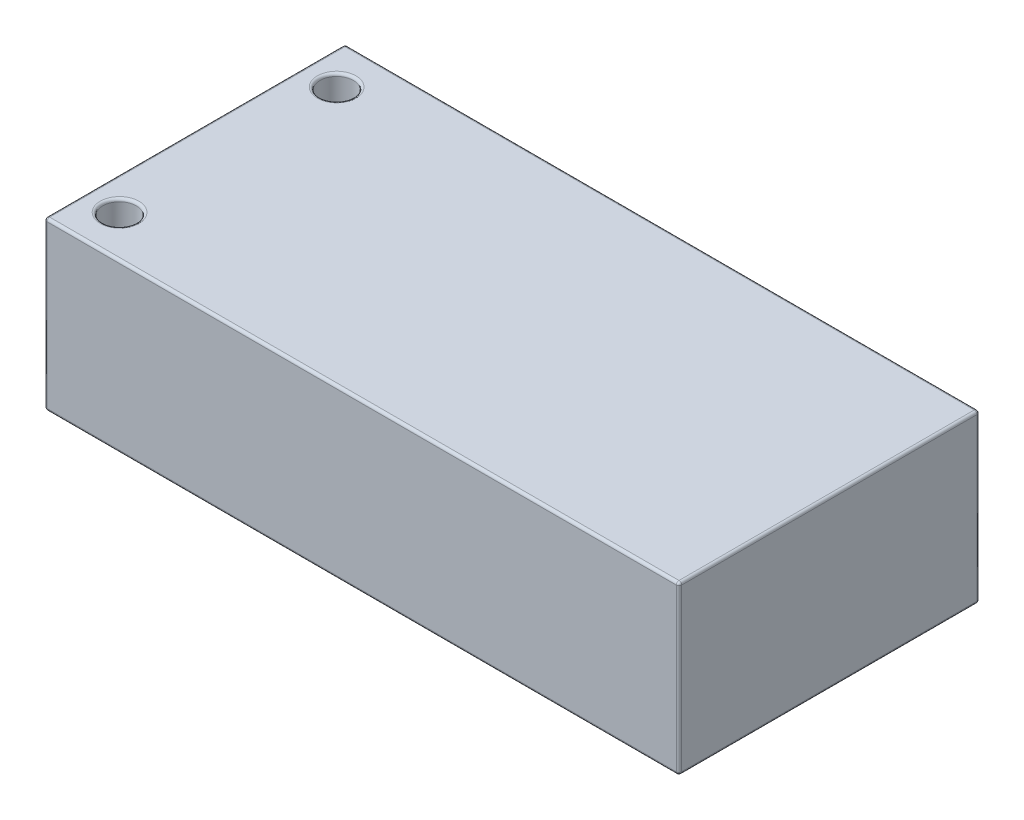
ISO-10303-21;
HEADER;
FILE_DESCRIPTION(('STEP AP214'),'2;1');
FILE_NAME('part.step','',(''),(''),'','','');
FILE_SCHEMA(('AUTOMOTIVE_DESIGN { 1 0 10303 214 1 1 1 1 }'));
ENDSEC;
DATA;
#1=APPLICATION_CONTEXT('core data for automotive mechanical design processes');
#2=APPLICATION_PROTOCOL_DEFINITION('international standard','automotive_design',2000,#1);
#3=PRODUCT_CONTEXT('',#1,'mechanical');
#4=PRODUCT('Part','Part','',(#3));
#5=PRODUCT_RELATED_PRODUCT_CATEGORY('part','',(#4));
#6=PRODUCT_DEFINITION_FORMATION('','',#4);
#7=PRODUCT_DEFINITION_CONTEXT('part definition',#1,'design');
#8=PRODUCT_DEFINITION('design','',#6,#7);
#9=PRODUCT_DEFINITION_SHAPE('','',#8);
#10=(LENGTH_UNIT() NAMED_UNIT(*) SI_UNIT(.MILLI.,.METRE.));
#11=(NAMED_UNIT(*) PLANE_ANGLE_UNIT() SI_UNIT($,.RADIAN.));
#12=(NAMED_UNIT(*) SI_UNIT($,.STERADIAN.) SOLID_ANGLE_UNIT());
#13=UNCERTAINTY_MEASURE_WITH_UNIT(LENGTH_MEASURE(1.E-05),#10,'distance_accuracy_value','');
#14=(GEOMETRIC_REPRESENTATION_CONTEXT(3) GLOBAL_UNCERTAINTY_ASSIGNED_CONTEXT((#13)) GLOBAL_UNIT_ASSIGNED_CONTEXT((#10,
#11,#12)) REPRESENTATION_CONTEXT('',''));
#15=CARTESIAN_POINT('',(0.,0.,0.));
#16=DIRECTION('',(0.,0.,1.));
#17=DIRECTION('',(1.,0.,0.));
#18=AXIS2_PLACEMENT_3D('',#15,#16,#17);
#19=CARTESIAN_POINT('',(0.,25.,0.));
#20=DIRECTION('',(1.,0.,0.));
#21=DIRECTION('',(0.,0.,-1.));
#22=AXIS2_PLACEMENT_3D('',#19,#20,#21);
#23=PLANE('',#22);
#24=DIRECTION('',(0.,0.,1.));
#25=VECTOR('',#24,1.);
#26=CARTESIAN_POINT('',(0.,24.6,0.));
#27=LINE('',#26,#25);
#28=CARTESIAN_POINT('',(0.,24.6,-0.4));
#29=VERTEX_POINT('',#28);
#30=CARTESIAN_POINT('',(0.,24.6,-44.6));
#31=VERTEX_POINT('',#30);
#32=EDGE_CURVE('E188',#29,#31,#27,.F.);
#33=ORIENTED_EDGE('',*,*,#32,.T.);
#34=DIRECTION('',(0.,-1.,0.));
#35=VECTOR('',#34,1.);
#36=CARTESIAN_POINT('',(0.,25.,-44.6));
#37=LINE('',#36,#35);
#38=CARTESIAN_POINT('',(0.,0.400000000000001,-44.6));
#39=VERTEX_POINT('',#38);
#40=EDGE_CURVE('E142',#31,#39,#37,.T.);
#41=ORIENTED_EDGE('',*,*,#40,.T.);
#42=DIRECTION('',(0.,0.,1.));
#43=VECTOR('',#42,1.);
#44=CARTESIAN_POINT('',(0.,0.400000000000001,0.));
#45=LINE('',#44,#43);
#46=CARTESIAN_POINT('',(0.,0.400000000000001,-0.4));
#47=VERTEX_POINT('',#46);
#48=EDGE_CURVE('E192',#39,#47,#45,.T.);
#49=ORIENTED_EDGE('',*,*,#48,.T.);
#50=DIRECTION('',(0.,-1.,0.));
#51=VECTOR('',#50,1.);
#52=CARTESIAN_POINT('',(0.,25.,-0.4));
#53=LINE('',#52,#51);
#54=EDGE_CURVE('E190',#47,#29,#53,.F.);
#55=ORIENTED_EDGE('',*,*,#54,.T.);
#56=EDGE_LOOP('',(#33,#41,#49,#55));
#57=FACE_BOUND('',#56,.T.);
#58=ADVANCED_FACE('F33',(#57),#23,.F.);
#59=CARTESIAN_POINT('',(0.,25.,0.));
#60=DIRECTION('',(0.,0.,-1.));
#61=DIRECTION('',(-1.,0.,0.));
#62=AXIS2_PLACEMENT_3D('',#59,#60,#61);
#63=PLANE('',#62);
#64=DIRECTION('',(0.,-1.,0.));
#65=VECTOR('',#64,1.);
#66=CARTESIAN_POINT('',(0.4,25.,0.));
#67=LINE('',#66,#65);
#68=CARTESIAN_POINT('',(0.4,24.6,0.));
#69=VERTEX_POINT('',#68);
#70=CARTESIAN_POINT('',(0.4,0.400000000000001,0.));
#71=VERTEX_POINT('',#70);
#72=EDGE_CURVE('E199',#69,#71,#67,.T.);
#73=ORIENTED_EDGE('',*,*,#72,.T.);
#74=DIRECTION('',(1.,0.,0.));
#75=VECTOR('',#74,1.);
#76=CARTESIAN_POINT('',(95.,0.400000000000001,0.));
#77=LINE('',#76,#75);
#78=CARTESIAN_POINT('',(94.6,0.400000000000001,0.));
#79=VERTEX_POINT('',#78);
#80=EDGE_CURVE('E202',#71,#79,#77,.T.);
#81=ORIENTED_EDGE('',*,*,#80,.T.);
#82=DIRECTION('',(0.,-1.,0.));
#83=VECTOR('',#82,1.);
#84=CARTESIAN_POINT('',(94.6,25.,0.));
#85=LINE('',#84,#83);
#86=CARTESIAN_POINT('',(94.6,24.6,0.));
#87=VERTEX_POINT('',#86);
#88=EDGE_CURVE('E197',#79,#87,#85,.F.);
#89=ORIENTED_EDGE('',*,*,#88,.T.);
#90=DIRECTION('',(1.,0.,0.));
#91=VECTOR('',#90,1.);
#92=CARTESIAN_POINT('',(0.,24.6,0.));
#93=LINE('',#92,#91);
#94=EDGE_CURVE('E195',#87,#69,#93,.F.);
#95=ORIENTED_EDGE('',*,*,#94,.T.);
#96=EDGE_LOOP('',(#73,#81,#89,#95));
#97=FACE_BOUND('',#96,.T.);
#98=ADVANCED_FACE('F297',(#97),#63,.F.);
#99=CARTESIAN_POINT('',(95.,25.,0.));
#100=DIRECTION('',(-1.,0.,0.));
#101=DIRECTION('',(0.,0.,1.));
#102=AXIS2_PLACEMENT_3D('',#99,#100,#101);
#103=PLANE('',#102);
#104=DIRECTION('',(0.,0.,-1.));
#105=VECTOR('',#104,1.);
#106=CARTESIAN_POINT('',(95.,0.400000000000001,-45.));
#107=LINE('',#106,#105);
#108=CARTESIAN_POINT('',(95.,0.400000000000001,-0.4));
#109=VERTEX_POINT('',#108);
#110=CARTESIAN_POINT('',(95.,0.400000000000001,-44.6));
#111=VERTEX_POINT('',#110);
#112=EDGE_CURVE('E174',#109,#111,#107,.T.);
#113=ORIENTED_EDGE('',*,*,#112,.T.);
#114=DIRECTION('',(0.,-1.,0.));
#115=VECTOR('',#114,1.);
#116=CARTESIAN_POINT('',(95.,25.,-44.6));
#117=LINE('',#116,#115);
#118=CARTESIAN_POINT('',(95.,24.6,-44.6));
#119=VERTEX_POINT('',#118);
#120=EDGE_CURVE('E176',#111,#119,#117,.F.);
#121=ORIENTED_EDGE('',*,*,#120,.T.);
#122=DIRECTION('',(0.,0.,-1.));
#123=VECTOR('',#122,1.);
#124=CARTESIAN_POINT('',(95.,24.6,0.));
#125=LINE('',#124,#123);
#126=CARTESIAN_POINT('',(95.,24.6,-0.4));
#127=VERTEX_POINT('',#126);
#128=EDGE_CURVE('E170',#119,#127,#125,.F.);
#129=ORIENTED_EDGE('',*,*,#128,.T.);
#130=DIRECTION('',(0.,-1.,0.));
#131=VECTOR('',#130,1.);
#132=CARTESIAN_POINT('',(95.,25.,-0.4));
#133=LINE('',#132,#131);
#134=EDGE_CURVE('E172',#127,#109,#133,.T.);
#135=ORIENTED_EDGE('',*,*,#134,.T.);
#136=EDGE_LOOP('',(#113,#121,#129,#135));
#137=FACE_BOUND('',#136,.T.);
#138=ADVANCED_FACE('F303',(#137),#103,.F.);
#139=CARTESIAN_POINT('',(0.,25.,-45.));
#140=DIRECTION('',(0.,0.,1.));
#141=DIRECTION('',(1.,0.,0.));
#142=AXIS2_PLACEMENT_3D('',#139,#140,#141);
#143=PLANE('',#142);
#144=DIRECTION('',(-1.,0.,0.));
#145=VECTOR('',#144,1.);
#146=CARTESIAN_POINT('',(0.,24.6,-45.));
#147=LINE('',#146,#145);
#148=CARTESIAN_POINT('',(0.4,24.6,-45.));
#149=VERTEX_POINT('',#148);
#150=CARTESIAN_POINT('',(94.6,24.6,-45.));
#151=VERTEX_POINT('',#150);
#152=EDGE_CURVE('E128',#149,#151,#147,.F.);
#153=ORIENTED_EDGE('',*,*,#152,.T.);
#154=DIRECTION('',(0.,-1.,0.));
#155=VECTOR('',#154,1.);
#156=CARTESIAN_POINT('',(94.6,25.,-45.));
#157=LINE('',#156,#155);
#158=CARTESIAN_POINT('',(94.6,0.400000000000001,-45.));
#159=VERTEX_POINT('',#158);
#160=EDGE_CURVE('E168',#151,#159,#157,.T.);
#161=ORIENTED_EDGE('',*,*,#160,.T.);
#162=DIRECTION('',(-1.,0.,0.));
#163=VECTOR('',#162,1.);
#164=CARTESIAN_POINT('',(0.,0.400000000000001,-45.));
#165=LINE('',#164,#163);
#166=CARTESIAN_POINT('',(0.4,0.400000000000001,-45.));
#167=VERTEX_POINT('',#166);
#168=EDGE_CURVE('E131',#159,#167,#165,.T.);
#169=ORIENTED_EDGE('',*,*,#168,.T.);
#170=DIRECTION('',(0.,-1.,0.));
#171=VECTOR('',#170,1.);
#172=CARTESIAN_POINT('',(0.4,25.,-45.));
#173=LINE('',#172,#171);
#174=EDGE_CURVE('E123',#167,#149,#173,.F.);
#175=ORIENTED_EDGE('',*,*,#174,.T.);
#176=EDGE_LOOP('',(#153,#161,#169,#175));
#177=FACE_BOUND('',#176,.T.);
#178=ADVANCED_FACE('F125',(#177),#143,.F.);
#179=CARTESIAN_POINT('',(0.,25.,0.));
#180=DIRECTION('',(0.,-1.,0.));
#181=DIRECTION('',(0.,0.,-1.));
#182=AXIS2_PLACEMENT_3D('',#179,#180,#181);
#183=PLANE('',#182);
#184=DIRECTION('',(0.,0.,-1.));
#185=VECTOR('',#184,1.);
#186=CARTESIAN_POINT('',(94.6,25.,0.));
#187=LINE('',#186,#185);
#188=CARTESIAN_POINT('',(94.6,25.,-0.4));
#189=VERTEX_POINT('',#188);
#190=CARTESIAN_POINT('',(94.6,25.,-44.6));
#191=VERTEX_POINT('',#190);
#192=EDGE_CURVE('E50',#189,#191,#187,.T.);
#193=ORIENTED_EDGE('',*,*,#192,.T.);
#194=DIRECTION('',(-1.,0.,0.));
#195=VECTOR('',#194,1.);
#196=CARTESIAN_POINT('',(0.,25.,-44.6));
#197=LINE('',#196,#195);
#198=CARTESIAN_POINT('',(0.4,25.,-44.6));
#199=VERTEX_POINT('',#198);
#200=EDGE_CURVE('E214',#191,#199,#197,.T.);
#201=ORIENTED_EDGE('',*,*,#200,.T.);
#202=DIRECTION('',(0.,0.,1.));
#203=VECTOR('',#202,1.);
#204=CARTESIAN_POINT('',(0.4,25.,0.));
#205=LINE('',#204,#203);
#206=CARTESIAN_POINT('',(0.4,25.,-0.4));
#207=VERTEX_POINT('',#206);
#208=EDGE_CURVE('E210',#199,#207,#205,.T.);
#209=ORIENTED_EDGE('',*,*,#208,.T.);
#210=DIRECTION('',(1.,0.,0.));
#211=VECTOR('',#210,1.);
#212=CARTESIAN_POINT('',(0.,25.,-0.4));
#213=LINE('',#212,#211);
#214=EDGE_CURVE('E55',#207,#189,#213,.T.);
#215=ORIENTED_EDGE('',*,*,#214,.T.);
#216=EDGE_LOOP('',(#193,#201,#209,#215));
#217=FACE_BOUND('',#216,.T.);
#218=CARTESIAN_POINT('',(5.,25.,-6.25));
#219=DIRECTION('',(0.,-1.,0.));
#220=DIRECTION('',(0.,0.,-1.));
#221=AXIS2_PLACEMENT_3D('',#218,#219,#220);
#222=CIRCLE('',#221,2.9);
#223=CARTESIAN_POINT('',(5.,25.,-9.15));
#224=VERTEX_POINT('',#223);
#225=EDGE_CURVE('E207',#224,#224,#222,.T.);
#226=ORIENTED_EDGE('',*,*,#225,.T.);
#227=EDGE_LOOP('',(#226));
#228=FACE_BOUND('',#227,.T.);
#229=CARTESIAN_POINT('',(5.,25.,-38.75));
#230=DIRECTION('',(0.,-1.,0.));
#231=DIRECTION('',(0.,0.,-1.));
#232=AXIS2_PLACEMENT_3D('',#229,#230,#231);
#233=CIRCLE('',#232,2.9);
#234=CARTESIAN_POINT('',(5.,25.,-41.65));
#235=VERTEX_POINT('',#234);
#236=EDGE_CURVE('E204',#235,#235,#233,.T.);
#237=ORIENTED_EDGE('',*,*,#236,.T.);
#238=EDGE_LOOP('',(#237));
#239=FACE_BOUND('',#238,.T.);
#240=ADVANCED_FACE('F292',(#217,#228,#239),#183,.F.);
#241=CARTESIAN_POINT('',(0.,0.,0.));
#242=DIRECTION('',(0.,-1.,0.));
#243=DIRECTION('',(0.,0.,-1.));
#244=AXIS2_PLACEMENT_3D('',#241,#242,#243);
#245=PLANE('',#244);
#246=DIRECTION('',(-1.,0.,0.));
#247=VECTOR('',#246,1.);
#248=CARTESIAN_POINT('',(95.,0.,-44.6));
#249=LINE('',#248,#247);
#250=CARTESIAN_POINT('',(0.4,0.,-44.6));
#251=VERTEX_POINT('',#250);
#252=CARTESIAN_POINT('',(94.6,0.,-44.6));
#253=VERTEX_POINT('',#252);
#254=EDGE_CURVE('E183',#251,#253,#249,.F.);
#255=ORIENTED_EDGE('',*,*,#254,.T.);
#256=DIRECTION('',(0.,0.,-1.));
#257=VECTOR('',#256,1.);
#258=CARTESIAN_POINT('',(94.6,0.,0.));
#259=LINE('',#258,#257);
#260=CARTESIAN_POINT('',(94.6,0.,-0.4));
#261=VERTEX_POINT('',#260);
#262=EDGE_CURVE('E185',#253,#261,#259,.F.);
#263=ORIENTED_EDGE('',*,*,#262,.T.);
#264=DIRECTION('',(1.,0.,0.));
#265=VECTOR('',#264,1.);
#266=CARTESIAN_POINT('',(0.,0.,-0.4));
#267=LINE('',#266,#265);
#268=CARTESIAN_POINT('',(0.4,0.,-0.4));
#269=VERTEX_POINT('',#268);
#270=EDGE_CURVE('E179',#261,#269,#267,.F.);
#271=ORIENTED_EDGE('',*,*,#270,.T.);
#272=DIRECTION('',(0.,0.,1.));
#273=VECTOR('',#272,1.);
#274=CARTESIAN_POINT('',(0.4,0.,-45.));
#275=LINE('',#274,#273);
#276=EDGE_CURVE('E181',#269,#251,#275,.F.);
#277=ORIENTED_EDGE('',*,*,#276,.T.);
#278=EDGE_LOOP('',(#255,#263,#271,#277));
#279=FACE_BOUND('',#278,.T.);
#280=ADVANCED_FACE('F283',(#279),#245,.T.);
#281=CARTESIAN_POINT('',(5.,15.,-6.25));
#282=DIRECTION('',(0.,1.,0.));
#283=DIRECTION('',(0.,0.,1.));
#284=AXIS2_PLACEMENT_3D('',#281,#282,#283);
#285=CYLINDRICAL_SURFACE('',#284,2.5);
#286=CARTESIAN_POINT('',(5.,24.6,-6.25));
#287=DIRECTION('',(0.,-1.,0.));
#288=DIRECTION('',(0.,0.,-1.));
#289=AXIS2_PLACEMENT_3D('',#286,#287,#288);
#290=CIRCLE('',#289,2.5);
#291=CARTESIAN_POINT('',(5.,24.6,-8.75));
#292=VERTEX_POINT('',#291);
#293=EDGE_CURVE('E42',#292,#292,#290,.F.);
#294=ORIENTED_EDGE('',*,*,#293,.T.);
#295=EDGE_LOOP('',(#294));
#296=FACE_BOUND('',#295,.T.);
#297=CARTESIAN_POINT('',(5.,15.,-6.25));
#298=DIRECTION('',(0.,1.,0.));
#299=DIRECTION('',(0.,0.,1.));
#300=AXIS2_PLACEMENT_3D('',#297,#298,#299);
#301=CIRCLE('',#300,2.5);
#302=CARTESIAN_POINT('',(5.,15.,-3.75));
#303=VERTEX_POINT('',#302);
#304=EDGE_CURVE('E163',#303,#303,#301,.T.);
#305=ORIENTED_EDGE('',*,*,#304,.F.);
#306=EDGE_LOOP('',(#305));
#307=FACE_BOUND('',#306,.T.);
#308=ADVANCED_FACE('F281',(#296,#307),#285,.F.);
#309=CARTESIAN_POINT('',(5.,15.,-6.25));
#310=DIRECTION('',(0.,1.,0.));
#311=DIRECTION('',(0.,0.,1.));
#312=AXIS2_PLACEMENT_3D('',#309,#310,#311);
#313=PLANE('',#312);
#314=ORIENTED_EDGE('',*,*,#304,.T.);
#315=EDGE_LOOP('',(#314));
#316=FACE_BOUND('',#315,.T.);
#317=ADVANCED_FACE('F279',(#316),#313,.T.);
#318=CARTESIAN_POINT('',(5.,15.,-38.75));
#319=DIRECTION('',(0.,1.,0.));
#320=DIRECTION('',(0.,0.,1.));
#321=AXIS2_PLACEMENT_3D('',#318,#319,#320);
#322=CYLINDRICAL_SURFACE('',#321,2.5);
#323=CARTESIAN_POINT('',(5.,24.6,-38.75));
#324=DIRECTION('',(0.,-1.,0.));
#325=DIRECTION('',(0.,0.,-1.));
#326=AXIS2_PLACEMENT_3D('',#323,#324,#325);
#327=CIRCLE('',#326,2.5);
#328=CARTESIAN_POINT('',(5.,24.6,-41.25));
#329=VERTEX_POINT('',#328);
#330=EDGE_CURVE('E11',#329,#329,#327,.F.);
#331=ORIENTED_EDGE('',*,*,#330,.T.);
#332=EDGE_LOOP('',(#331));
#333=FACE_BOUND('',#332,.T.);
#334=CARTESIAN_POINT('',(5.,15.,-38.75));
#335=DIRECTION('',(0.,1.,0.));
#336=DIRECTION('',(0.,0.,1.));
#337=AXIS2_PLACEMENT_3D('',#334,#335,#336);
#338=CIRCLE('',#337,2.5);
#339=CARTESIAN_POINT('',(5.,15.,-36.25));
#340=VERTEX_POINT('',#339);
#341=EDGE_CURVE('E160',#340,#340,#338,.T.);
#342=ORIENTED_EDGE('',*,*,#341,.F.);
#343=EDGE_LOOP('',(#342));
#344=FACE_BOUND('',#343,.T.);
#345=ADVANCED_FACE('F290',(#333,#344),#322,.F.);
#346=CARTESIAN_POINT('',(5.,15.,-38.75));
#347=DIRECTION('',(0.,1.,0.));
#348=DIRECTION('',(0.,0.,1.));
#349=AXIS2_PLACEMENT_3D('',#346,#347,#348);
#350=PLANE('',#349);
#351=ORIENTED_EDGE('',*,*,#341,.T.);
#352=EDGE_LOOP('',(#351));
#353=FACE_BOUND('',#352,.T.);
#354=ADVANCED_FACE('F379',(#353),#350,.T.);
#355=CARTESIAN_POINT('',(0.4,25.,-0.4));
#356=DIRECTION('',(0.,-1.,0.));
#357=DIRECTION('',(0.,0.,-1.));
#358=AXIS2_PLACEMENT_3D('',#355,#356,#357);
#359=CYLINDRICAL_SURFACE('',#358,0.4);
#360=CARTESIAN_POINT('',(0.4,24.6,-0.4));
#361=DIRECTION('',(0.,1.,0.));
#362=DIRECTION('',(0.,0.,1.));
#363=AXIS2_PLACEMENT_3D('',#360,#361,#362);
#364=CIRCLE('',#363,0.4);
#365=EDGE_CURVE('E37',#29,#69,#364,.T.);
#366=ORIENTED_EDGE('',*,*,#365,.F.);
#367=ORIENTED_EDGE('',*,*,#54,.F.);
#368=CARTESIAN_POINT('',(0.4,0.400000000000001,-0.4));
#369=DIRECTION('',(0.,-1.,0.));
#370=DIRECTION('',(0.,0.,-1.));
#371=AXIS2_PLACEMENT_3D('',#368,#369,#370);
#372=CIRCLE('',#371,0.4);
#373=EDGE_CURVE('E265',#71,#47,#372,.T.);
#374=ORIENTED_EDGE('',*,*,#373,.F.);
#375=ORIENTED_EDGE('',*,*,#72,.F.);
#376=EDGE_LOOP('',(#366,#367,#374,#375));
#377=FACE_BOUND('',#376,.T.);
#378=ADVANCED_FACE('F377',(#377),#359,.T.);
#379=CARTESIAN_POINT('',(0.4,24.6,-0.4));
#380=DIRECTION('',(0.,0.,1.));
#381=DIRECTION('',(1.,0.,0.));
#382=AXIS2_PLACEMENT_3D('',#379,#380,#381);
#383=SPHERICAL_SURFACE('',#382,0.4);
#384=CARTESIAN_POINT('',(0.4,24.6,-0.4));
#385=DIRECTION('',(0.,0.,1.));
#386=DIRECTION('',(1.,0.,0.));
#387=AXIS2_PLACEMENT_3D('',#384,#385,#386);
#388=CIRCLE('',#387,0.4);
#389=EDGE_CURVE('E260',#29,#207,#388,.F.);
#390=ORIENTED_EDGE('',*,*,#389,.F.);
#391=ORIENTED_EDGE('',*,*,#365,.T.);
#392=CARTESIAN_POINT('',(0.4,24.6,-0.4));
#393=DIRECTION('',(-1.,0.,0.));
#394=DIRECTION('',(0.,0.,1.));
#395=AXIS2_PLACEMENT_3D('',#392,#393,#394);
#396=CIRCLE('',#395,0.4);
#397=EDGE_CURVE('E263',#207,#69,#396,.F.);
#398=ORIENTED_EDGE('',*,*,#397,.F.);
#399=EDGE_LOOP('',(#390,#391,#398));
#400=FACE_BOUND('',#399,.T.);
#401=ADVANCED_FACE('F374',(#400),#383,.T.);
#402=CARTESIAN_POINT('',(0.4,0.4,-0.4));
#403=DIRECTION('',(0.,0.,1.));
#404=DIRECTION('',(1.,0.,0.));
#405=AXIS2_PLACEMENT_3D('',#402,#403,#404);
#406=SPHERICAL_SURFACE('',#405,0.4);
#407=CARTESIAN_POINT('',(0.4,0.4,-0.4));
#408=DIRECTION('',(-1.,0.,0.));
#409=DIRECTION('',(0.,0.,1.));
#410=AXIS2_PLACEMENT_3D('',#407,#408,#409);
#411=CIRCLE('',#410,0.4);
#412=EDGE_CURVE('E254',#71,#269,#411,.F.);
#413=ORIENTED_EDGE('',*,*,#412,.F.);
#414=ORIENTED_EDGE('',*,*,#373,.T.);
#415=CARTESIAN_POINT('',(0.4,0.400000000000001,-0.4));
#416=DIRECTION('',(0.,0.,1.));
#417=DIRECTION('',(1.,0.,0.));
#418=AXIS2_PLACEMENT_3D('',#415,#416,#417);
#419=CIRCLE('',#418,0.4);
#420=EDGE_CURVE('E257',#269,#47,#419,.F.);
#421=ORIENTED_EDGE('',*,*,#420,.F.);
#422=EDGE_LOOP('',(#413,#414,#421));
#423=FACE_BOUND('',#422,.T.);
#424=ADVANCED_FACE('F370',(#423),#406,.T.);
#425=CARTESIAN_POINT('',(0.,24.6,-0.4));
#426=DIRECTION('',(1.,0.,0.));
#427=DIRECTION('',(0.,0.,-1.));
#428=AXIS2_PLACEMENT_3D('',#425,#426,#427);
#429=CYLINDRICAL_SURFACE('',#428,0.4);
#430=ORIENTED_EDGE('',*,*,#397,.T.);
#431=ORIENTED_EDGE('',*,*,#94,.F.);
#432=CARTESIAN_POINT('',(94.6,24.6,-0.4));
#433=DIRECTION('',(1.,0.,0.));
#434=DIRECTION('',(0.,0.,-1.));
#435=AXIS2_PLACEMENT_3D('',#432,#433,#434);
#436=CIRCLE('',#435,0.4);
#437=EDGE_CURVE('E248',#189,#87,#436,.T.);
#438=ORIENTED_EDGE('',*,*,#437,.F.);
#439=ORIENTED_EDGE('',*,*,#214,.F.);
#440=EDGE_LOOP('',(#430,#431,#438,#439));
#441=FACE_BOUND('',#440,.T.);
#442=ADVANCED_FACE('F366',(#441),#429,.T.);
#443=CARTESIAN_POINT('',(0.4,24.6,0.));
#444=DIRECTION('',(0.,0.,1.));
#445=DIRECTION('',(1.,0.,0.));
#446=AXIS2_PLACEMENT_3D('',#443,#444,#445);
#447=CYLINDRICAL_SURFACE('',#446,0.4);
#448=ORIENTED_EDGE('',*,*,#389,.T.);
#449=ORIENTED_EDGE('',*,*,#208,.F.);
#450=CARTESIAN_POINT('',(0.4,24.6,-44.6));
#451=DIRECTION('',(0.,0.,-1.));
#452=DIRECTION('',(-1.,0.,0.));
#453=AXIS2_PLACEMENT_3D('',#450,#451,#452);
#454=CIRCLE('',#453,0.4);
#455=EDGE_CURVE('E146',#31,#199,#454,.T.);
#456=ORIENTED_EDGE('',*,*,#455,.F.);
#457=ORIENTED_EDGE('',*,*,#32,.F.);
#458=EDGE_LOOP('',(#448,#449,#456,#457));
#459=FACE_BOUND('',#458,.T.);
#460=ADVANCED_FACE('F363',(#459),#447,.T.);
#461=CARTESIAN_POINT('',(0.4,25.,-44.6));
#462=DIRECTION('',(0.,-1.,0.));
#463=DIRECTION('',(0.,0.,-1.));
#464=AXIS2_PLACEMENT_3D('',#461,#462,#463);
#465=CYLINDRICAL_SURFACE('',#464,0.4);
#466=CARTESIAN_POINT('',(0.4,0.400000000000001,-44.6));
#467=DIRECTION('',(0.,-1.,0.));
#468=DIRECTION('',(0.,0.,-1.));
#469=AXIS2_PLACEMENT_3D('',#466,#467,#468);
#470=CIRCLE('',#469,0.4);
#471=EDGE_CURVE('E147',#39,#167,#470,.T.);
#472=ORIENTED_EDGE('',*,*,#471,.F.);
#473=ORIENTED_EDGE('',*,*,#40,.F.);
#474=CARTESIAN_POINT('',(0.4,24.6,-44.6));
#475=DIRECTION('',(0.,1.,0.));
#476=DIRECTION('',(0.,0.,1.));
#477=AXIS2_PLACEMENT_3D('',#474,#475,#476);
#478=CIRCLE('',#477,0.4);
#479=EDGE_CURVE('E138',#149,#31,#478,.T.);
#480=ORIENTED_EDGE('',*,*,#479,.F.);
#481=ORIENTED_EDGE('',*,*,#174,.F.);
#482=EDGE_LOOP('',(#472,#473,#480,#481));
#483=FACE_BOUND('',#482,.T.);
#484=ADVANCED_FACE('F140',(#483),#465,.T.);
#485=CARTESIAN_POINT('',(0.4,0.400000000000001,0.));
#486=DIRECTION('',(0.,0.,-1.));
#487=DIRECTION('',(-1.,0.,0.));
#488=AXIS2_PLACEMENT_3D('',#485,#486,#487);
#489=CYLINDRICAL_SURFACE('',#488,0.4);
#490=ORIENTED_EDGE('',*,*,#420,.T.);
#491=ORIENTED_EDGE('',*,*,#48,.F.);
#492=CARTESIAN_POINT('',(0.4,0.4,-44.6));
#493=DIRECTION('',(0.,0.,-1.));
#494=DIRECTION('',(-1.,0.,0.));
#495=AXIS2_PLACEMENT_3D('',#492,#493,#494);
#496=CIRCLE('',#495,0.4);
#497=EDGE_CURVE('E244',#251,#39,#496,.T.);
#498=ORIENTED_EDGE('',*,*,#497,.F.);
#499=ORIENTED_EDGE('',*,*,#276,.F.);
#500=EDGE_LOOP('',(#490,#491,#498,#499));
#501=FACE_BOUND('',#500,.T.);
#502=ADVANCED_FACE('F356',(#501),#489,.T.);
#503=CARTESIAN_POINT('',(0.,0.400000000000001,-0.4));
#504=DIRECTION('',(-1.,0.,0.));
#505=DIRECTION('',(0.,0.,1.));
#506=AXIS2_PLACEMENT_3D('',#503,#504,#505);
#507=CYLINDRICAL_SURFACE('',#506,0.4);
#508=ORIENTED_EDGE('',*,*,#412,.T.);
#509=ORIENTED_EDGE('',*,*,#270,.F.);
#510=CARTESIAN_POINT('',(94.6,0.400000000000001,-0.4));
#511=DIRECTION('',(1.,0.,0.));
#512=DIRECTION('',(0.,0.,-1.));
#513=AXIS2_PLACEMENT_3D('',#510,#511,#512);
#514=CIRCLE('',#513,0.4);
#515=EDGE_CURVE('E241',#79,#261,#514,.T.);
#516=ORIENTED_EDGE('',*,*,#515,.F.);
#517=ORIENTED_EDGE('',*,*,#80,.F.);
#518=EDGE_LOOP('',(#508,#509,#516,#517));
#519=FACE_BOUND('',#518,.T.);
#520=ADVANCED_FACE('F352',(#519),#507,.T.);
#521=CARTESIAN_POINT('',(94.6,25.,-0.4));
#522=DIRECTION('',(0.,-1.,0.));
#523=DIRECTION('',(0.,0.,-1.));
#524=AXIS2_PLACEMENT_3D('',#521,#522,#523);
#525=CYLINDRICAL_SURFACE('',#524,0.4);
#526=CARTESIAN_POINT('',(94.6,24.6,-0.4));
#527=DIRECTION('',(0.,1.,0.));
#528=DIRECTION('',(0.,0.,1.));
#529=AXIS2_PLACEMENT_3D('',#526,#527,#528);
#530=CIRCLE('',#529,0.4);
#531=EDGE_CURVE('E251',#87,#127,#530,.T.);
#532=ORIENTED_EDGE('',*,*,#531,.F.);
#533=ORIENTED_EDGE('',*,*,#88,.F.);
#534=CARTESIAN_POINT('',(94.6,0.400000000000001,-0.4));
#535=DIRECTION('',(0.,-1.,0.));
#536=DIRECTION('',(0.,0.,-1.));
#537=AXIS2_PLACEMENT_3D('',#534,#535,#536);
#538=CIRCLE('',#537,0.4);
#539=EDGE_CURVE('E238',#109,#79,#538,.T.);
#540=ORIENTED_EDGE('',*,*,#539,.F.);
#541=ORIENTED_EDGE('',*,*,#134,.F.);
#542=EDGE_LOOP('',(#532,#533,#540,#541));
#543=FACE_BOUND('',#542,.T.);
#544=ADVANCED_FACE('F348',(#543),#525,.T.);
#545=CARTESIAN_POINT('',(94.6,24.6,-0.4));
#546=DIRECTION('',(0.,0.,1.));
#547=DIRECTION('',(1.,0.,0.));
#548=AXIS2_PLACEMENT_3D('',#545,#546,#547);
#549=SPHERICAL_SURFACE('',#548,0.4);
#550=ORIENTED_EDGE('',*,*,#437,.T.);
#551=ORIENTED_EDGE('',*,*,#531,.T.);
#552=CARTESIAN_POINT('',(94.6,24.6,-0.4));
#553=DIRECTION('',(0.,0.,1.));
#554=DIRECTION('',(1.,0.,0.));
#555=AXIS2_PLACEMENT_3D('',#552,#553,#554);
#556=CIRCLE('',#555,0.4);
#557=EDGE_CURVE('E153',#189,#127,#556,.F.);
#558=ORIENTED_EDGE('',*,*,#557,.F.);
#559=EDGE_LOOP('',(#550,#551,#558));
#560=FACE_BOUND('',#559,.T.);
#561=ADVANCED_FACE('F345',(#560),#549,.T.);
#562=CARTESIAN_POINT('',(0.4,24.6,-44.6));
#563=DIRECTION('',(0.,0.,1.));
#564=DIRECTION('',(1.,0.,0.));
#565=AXIS2_PLACEMENT_3D('',#562,#563,#564);
#566=SPHERICAL_SURFACE('',#565,0.4);
#567=ORIENTED_EDGE('',*,*,#479,.T.);
#568=ORIENTED_EDGE('',*,*,#455,.T.);
#569=CARTESIAN_POINT('',(0.4,24.6,-44.6));
#570=DIRECTION('',(-1.,0.,0.));
#571=DIRECTION('',(0.,0.,1.));
#572=AXIS2_PLACEMENT_3D('',#569,#570,#571);
#573=CIRCLE('',#572,0.4);
#574=EDGE_CURVE('E149',#149,#199,#573,.F.);
#575=ORIENTED_EDGE('',*,*,#574,.F.);
#576=EDGE_LOOP('',(#567,#568,#575));
#577=FACE_BOUND('',#576,.T.);
#578=ADVANCED_FACE('F150',(#577),#566,.T.);
#579=CARTESIAN_POINT('',(0.4,0.4,-44.6));
#580=DIRECTION('',(0.,0.,1.));
#581=DIRECTION('',(1.,0.,0.));
#582=AXIS2_PLACEMENT_3D('',#579,#580,#581);
#583=SPHERICAL_SURFACE('',#582,0.4);
#584=ORIENTED_EDGE('',*,*,#497,.T.);
#585=ORIENTED_EDGE('',*,*,#471,.T.);
#586=CARTESIAN_POINT('',(0.4,0.400000000000001,-44.6));
#587=DIRECTION('',(-1.,0.,0.));
#588=DIRECTION('',(0.,0.,1.));
#589=AXIS2_PLACEMENT_3D('',#586,#587,#588);
#590=CIRCLE('',#589,0.4);
#591=EDGE_CURVE('E154',#251,#167,#590,.F.);
#592=ORIENTED_EDGE('',*,*,#591,.F.);
#593=EDGE_LOOP('',(#584,#585,#592));
#594=FACE_BOUND('',#593,.T.);
#595=ADVANCED_FACE('F338',(#594),#583,.T.);
#596=CARTESIAN_POINT('',(94.6,0.4,-0.4));
#597=DIRECTION('',(0.,0.,1.));
#598=DIRECTION('',(1.,0.,0.));
#599=AXIS2_PLACEMENT_3D('',#596,#597,#598);
#600=SPHERICAL_SURFACE('',#599,0.4);
#601=ORIENTED_EDGE('',*,*,#539,.T.);
#602=ORIENTED_EDGE('',*,*,#515,.T.);
#603=CARTESIAN_POINT('',(94.6,0.4,-0.4));
#604=DIRECTION('',(0.,0.,1.));
#605=DIRECTION('',(1.,0.,0.));
#606=AXIS2_PLACEMENT_3D('',#603,#604,#605);
#607=CIRCLE('',#606,0.4);
#608=EDGE_CURVE('E232',#109,#261,#607,.F.);
#609=ORIENTED_EDGE('',*,*,#608,.F.);
#610=EDGE_LOOP('',(#601,#602,#609));
#611=FACE_BOUND('',#610,.T.);
#612=ADVANCED_FACE('F334',(#611),#600,.T.);
#613=CARTESIAN_POINT('',(94.6,24.6,0.));
#614=DIRECTION('',(0.,0.,-1.));
#615=DIRECTION('',(-1.,0.,0.));
#616=AXIS2_PLACEMENT_3D('',#613,#614,#615);
#617=CYLINDRICAL_SURFACE('',#616,0.4);
#618=ORIENTED_EDGE('',*,*,#557,.T.);
#619=ORIENTED_EDGE('',*,*,#128,.F.);
#620=CARTESIAN_POINT('',(94.6,24.6,-44.6));
#621=DIRECTION('',(0.,0.,-1.));
#622=DIRECTION('',(-1.,0.,0.));
#623=AXIS2_PLACEMENT_3D('',#620,#621,#622);
#624=CIRCLE('',#623,0.4);
#625=EDGE_CURVE('E229',#191,#119,#624,.T.);
#626=ORIENTED_EDGE('',*,*,#625,.F.);
#627=ORIENTED_EDGE('',*,*,#192,.F.);
#628=EDGE_LOOP('',(#618,#619,#626,#627));
#629=FACE_BOUND('',#628,.T.);
#630=ADVANCED_FACE('F331',(#629),#617,.T.);
#631=CARTESIAN_POINT('',(0.,24.6,-44.6));
#632=DIRECTION('',(-1.,0.,0.));
#633=DIRECTION('',(0.,0.,1.));
#634=AXIS2_PLACEMENT_3D('',#631,#632,#633);
#635=CYLINDRICAL_SURFACE('',#634,0.4);
#636=ORIENTED_EDGE('',*,*,#574,.T.);
#637=ORIENTED_EDGE('',*,*,#200,.F.);
#638=CARTESIAN_POINT('',(94.6,24.6,-44.6));
#639=DIRECTION('',(1.,0.,0.));
#640=DIRECTION('',(0.,0.,-1.));
#641=AXIS2_PLACEMENT_3D('',#638,#639,#640);
#642=CIRCLE('',#641,0.4);
#643=EDGE_CURVE('E158',#151,#191,#642,.T.);
#644=ORIENTED_EDGE('',*,*,#643,.F.);
#645=ORIENTED_EDGE('',*,*,#152,.F.);
#646=EDGE_LOOP('',(#636,#637,#644,#645));
#647=FACE_BOUND('',#646,.T.);
#648=ADVANCED_FACE('F156',(#647),#635,.T.);
#649=CARTESIAN_POINT('',(0.,0.400000000000001,-44.6));
#650=DIRECTION('',(1.,0.,0.));
#651=DIRECTION('',(0.,0.,-1.));
#652=AXIS2_PLACEMENT_3D('',#649,#650,#651);
#653=CYLINDRICAL_SURFACE('',#652,0.4);
#654=ORIENTED_EDGE('',*,*,#591,.T.);
#655=ORIENTED_EDGE('',*,*,#168,.F.);
#656=CARTESIAN_POINT('',(94.6,0.4,-44.6));
#657=DIRECTION('',(1.,0.,0.));
#658=DIRECTION('',(0.,0.,-1.));
#659=AXIS2_PLACEMENT_3D('',#656,#657,#658);
#660=CIRCLE('',#659,0.4);
#661=EDGE_CURVE('E225',#253,#159,#660,.T.);
#662=ORIENTED_EDGE('',*,*,#661,.F.);
#663=ORIENTED_EDGE('',*,*,#254,.F.);
#664=EDGE_LOOP('',(#654,#655,#662,#663));
#665=FACE_BOUND('',#664,.T.);
#666=ADVANCED_FACE('F324',(#665),#653,.T.);
#667=CARTESIAN_POINT('',(94.6,0.400000000000001,0.));
#668=DIRECTION('',(0.,0.,1.));
#669=DIRECTION('',(1.,0.,0.));
#670=AXIS2_PLACEMENT_3D('',#667,#668,#669);
#671=CYLINDRICAL_SURFACE('',#670,0.4);
#672=ORIENTED_EDGE('',*,*,#608,.T.);
#673=ORIENTED_EDGE('',*,*,#262,.F.);
#674=CARTESIAN_POINT('',(94.6,0.400000000000001,-44.6));
#675=DIRECTION('',(0.,0.,-1.));
#676=DIRECTION('',(-1.,0.,0.));
#677=AXIS2_PLACEMENT_3D('',#674,#675,#676);
#678=CIRCLE('',#677,0.4);
#679=EDGE_CURVE('E222',#111,#253,#678,.T.);
#680=ORIENTED_EDGE('',*,*,#679,.F.);
#681=ORIENTED_EDGE('',*,*,#112,.F.);
#682=EDGE_LOOP('',(#672,#673,#680,#681));
#683=FACE_BOUND('',#682,.T.);
#684=ADVANCED_FACE('F320',(#683),#671,.T.);
#685=CARTESIAN_POINT('',(94.6,24.6,-44.6));
#686=DIRECTION('',(0.,0.,1.));
#687=DIRECTION('',(1.,0.,0.));
#688=AXIS2_PLACEMENT_3D('',#685,#686,#687);
#689=SPHERICAL_SURFACE('',#688,0.4);
#690=ORIENTED_EDGE('',*,*,#643,.T.);
#691=ORIENTED_EDGE('',*,*,#625,.T.);
#692=CARTESIAN_POINT('',(94.6,24.6,-44.6));
#693=DIRECTION('',(0.,1.,0.));
#694=DIRECTION('',(0.,0.,1.));
#695=AXIS2_PLACEMENT_3D('',#692,#693,#694);
#696=CIRCLE('',#695,0.4);
#697=EDGE_CURVE('E220',#151,#119,#696,.F.);
#698=ORIENTED_EDGE('',*,*,#697,.F.);
#699=EDGE_LOOP('',(#690,#691,#698));
#700=FACE_BOUND('',#699,.T.);
#701=ADVANCED_FACE('F316',(#700),#689,.T.);
#702=CARTESIAN_POINT('',(94.6,0.4,-44.6));
#703=DIRECTION('',(0.,0.,1.));
#704=DIRECTION('',(1.,0.,0.));
#705=AXIS2_PLACEMENT_3D('',#702,#703,#704);
#706=SPHERICAL_SURFACE('',#705,0.4);
#707=ORIENTED_EDGE('',*,*,#679,.T.);
#708=ORIENTED_EDGE('',*,*,#661,.T.);
#709=CARTESIAN_POINT('',(94.6,0.400000000000001,-44.6));
#710=DIRECTION('',(0.,-1.,0.));
#711=DIRECTION('',(0.,0.,-1.));
#712=AXIS2_PLACEMENT_3D('',#709,#710,#711);
#713=CIRCLE('',#712,0.4);
#714=EDGE_CURVE('E218',#111,#159,#713,.F.);
#715=ORIENTED_EDGE('',*,*,#714,.F.);
#716=EDGE_LOOP('',(#707,#708,#715));
#717=FACE_BOUND('',#716,.T.);
#718=ADVANCED_FACE('F312',(#717),#706,.T.);
#719=CARTESIAN_POINT('',(94.6,25.,-44.6));
#720=DIRECTION('',(0.,-1.,0.));
#721=DIRECTION('',(0.,0.,-1.));
#722=AXIS2_PLACEMENT_3D('',#719,#720,#721);
#723=CYLINDRICAL_SURFACE('',#722,0.4);
#724=ORIENTED_EDGE('',*,*,#697,.T.);
#725=ORIENTED_EDGE('',*,*,#120,.F.);
#726=ORIENTED_EDGE('',*,*,#714,.T.);
#727=ORIENTED_EDGE('',*,*,#160,.F.);
#728=EDGE_LOOP('',(#724,#725,#726,#727));
#729=FACE_BOUND('',#728,.T.);
#730=ADVANCED_FACE('F308',(#729),#723,.T.);
#731=CARTESIAN_POINT('',(5.,24.6,-6.25));
#732=DIRECTION('',(0.,-1.,0.));
#733=DIRECTION('',(0.,0.,-1.));
#734=AXIS2_PLACEMENT_3D('',#731,#732,#733);
#735=TOROIDAL_SURFACE('',#734,2.9,0.4);
#736=ORIENTED_EDGE('',*,*,#225,.F.);
#737=EDGE_LOOP('',(#736));
#738=FACE_BOUND('',#737,.T.);
#739=ORIENTED_EDGE('',*,*,#293,.F.);
#740=EDGE_LOOP('',(#739));
#741=FACE_BOUND('',#740,.T.);
#742=ADVANCED_FACE('F311',(#738,#741),#735,.T.);
#743=CARTESIAN_POINT('',(5.,24.6,-38.75));
#744=DIRECTION('',(0.,-1.,0.));
#745=DIRECTION('',(0.,0.,-1.));
#746=AXIS2_PLACEMENT_3D('',#743,#744,#745);
#747=TOROIDAL_SURFACE('',#746,2.9,0.4);
#748=ORIENTED_EDGE('',*,*,#236,.F.);
#749=EDGE_LOOP('',(#748));
#750=FACE_BOUND('',#749,.T.);
#751=ORIENTED_EDGE('',*,*,#330,.F.);
#752=EDGE_LOOP('',(#751));
#753=FACE_BOUND('',#752,.T.);
#754=ADVANCED_FACE('F35',(#750,#753),#747,.T.);
#755=CLOSED_SHELL('',(#58,#98,#138,#178,#240,#280,#308,#317,#345,#354,#378,#401,#424,#442,#460,
#484,#502,#520,#544,#561,#578,#595,#612,#630,#648,#666,#684,#701,#718,#730,#742,#754));
#756=MANIFOLD_SOLID_BREP('B2',#755);
#757=ADVANCED_BREP_SHAPE_REPRESENTATION('',(#18,#756),#14);
#758=SHAPE_DEFINITION_REPRESENTATION(#9,#757);
ENDSEC;
END-ISO-10303-21;
